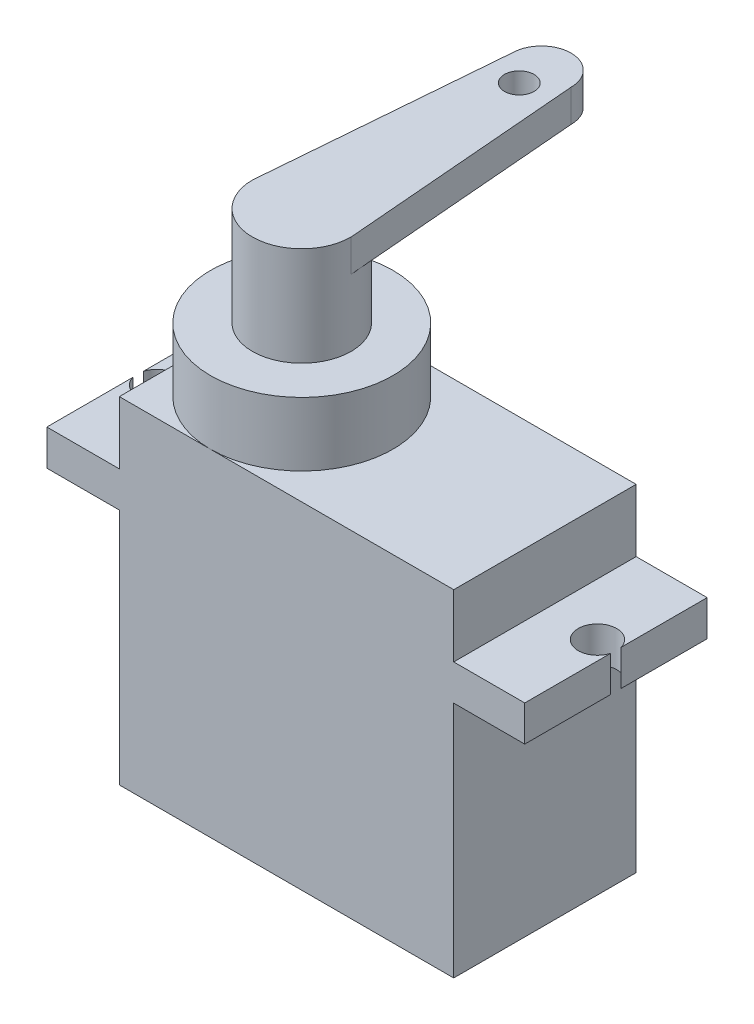
ISO-10303-21;
HEADER;
FILE_DESCRIPTION(('STEP AP214'),'2;1');
FILE_NAME('part.step','',(''),(''),'','','');
FILE_SCHEMA(('AUTOMOTIVE_DESIGN { 1 0 10303 214 1 1 1 1 }'));
ENDSEC;
DATA;
#1=APPLICATION_CONTEXT('core data for automotive mechanical design processes');
#2=APPLICATION_PROTOCOL_DEFINITION('international standard','automotive_design',2000,#1);
#3=PRODUCT_CONTEXT('',#1,'mechanical');
#4=PRODUCT('Part','Part','',(#3));
#5=PRODUCT_RELATED_PRODUCT_CATEGORY('part','',(#4));
#6=PRODUCT_DEFINITION_FORMATION('','',#4);
#7=PRODUCT_DEFINITION_CONTEXT('part definition',#1,'design');
#8=PRODUCT_DEFINITION('design','',#6,#7);
#9=PRODUCT_DEFINITION_SHAPE('','',#8);
#10=(LENGTH_UNIT() NAMED_UNIT(*) SI_UNIT(.MILLI.,.METRE.));
#11=(NAMED_UNIT(*) PLANE_ANGLE_UNIT() SI_UNIT($,.RADIAN.));
#12=(NAMED_UNIT(*) SI_UNIT($,.STERADIAN.) SOLID_ANGLE_UNIT());
#13=UNCERTAINTY_MEASURE_WITH_UNIT(LENGTH_MEASURE(1.E-05),#10,'distance_accuracy_value','');
#14=(GEOMETRIC_REPRESENTATION_CONTEXT(3) GLOBAL_UNCERTAINTY_ASSIGNED_CONTEXT((#13)) GLOBAL_UNIT_ASSIGNED_CONTEXT((#10,
#11,#12)) REPRESENTATION_CONTEXT('',''));
#15=CARTESIAN_POINT('',(0.,0.,0.));
#16=DIRECTION('',(0.,0.,1.));
#17=DIRECTION('',(1.,0.,0.));
#18=AXIS2_PLACEMENT_3D('',#15,#16,#17);
#19=CARTESIAN_POINT('',(27.4,18.5,-12.33));
#20=DIRECTION('',(-1.,0.,0.));
#21=DIRECTION('',(0.,0.,1.));
#22=AXIS2_PLACEMENT_3D('',#19,#20,#21);
#23=PLANE('',#22);
#24=DIRECTION('',(0.,0.,-1.));
#25=VECTOR('',#24,1.);
#26=CARTESIAN_POINT('',(27.4,16.09,-12.33));
#27=LINE('',#26,#25);
#28=CARTESIAN_POINT('',(27.4,16.09,0.));
#29=VERTEX_POINT('',#28);
#30=CARTESIAN_POINT('',(27.4,16.09,-5.80792857857286));
#31=VERTEX_POINT('',#30);
#32=EDGE_CURVE('E202',#29,#31,#27,.T.);
#33=ORIENTED_EDGE('',*,*,#32,.T.);
#34=DIRECTION('',(0.,1.,0.));
#35=VECTOR('',#34,1.);
#36=CARTESIAN_POINT('',(27.4,14.5,-5.80792857857286));
#37=LINE('',#36,#35);
#38=CARTESIAN_POINT('',(27.4,18.5,-5.80792857857286));
#39=VERTEX_POINT('',#38);
#40=EDGE_CURVE('E191',#31,#39,#37,.T.);
#41=ORIENTED_EDGE('',*,*,#40,.T.);
#42=DIRECTION('',(0.,0.,-1.));
#43=VECTOR('',#42,1.);
#44=CARTESIAN_POINT('',(27.4,18.5,-12.33));
#45=LINE('',#44,#43);
#46=CARTESIAN_POINT('',(27.4,18.5,0.));
#47=VERTEX_POINT('',#46);
#48=EDGE_CURVE('E200',#47,#39,#45,.T.);
#49=ORIENTED_EDGE('',*,*,#48,.F.);
#50=DIRECTION('',(0.,-1.,0.));
#51=VECTOR('',#50,1.);
#52=CARTESIAN_POINT('',(27.4,18.5,0.));
#53=LINE('',#52,#51);
#54=EDGE_CURVE('E251',#47,#29,#53,.T.);
#55=ORIENTED_EDGE('',*,*,#54,.T.);
#56=EDGE_LOOP('',(#33,#41,#49,#55));
#57=FACE_BOUND('',#56,.T.);
#58=ADVANCED_FACE('F40',(#57),#23,.F.);
#59=CARTESIAN_POINT('',(-4.9,18.5,-12.33));
#60=DIRECTION('',(1.,0.,0.));
#61=DIRECTION('',(0.,0.,-1.));
#62=AXIS2_PLACEMENT_3D('',#59,#60,#61);
#63=PLANE('',#62);
#64=DIRECTION('',(0.,0.,1.));
#65=VECTOR('',#64,1.);
#66=CARTESIAN_POINT('',(-4.9,16.09,-12.33));
#67=LINE('',#66,#65);
#68=CARTESIAN_POINT('',(-4.9,16.09,-12.33));
#69=VERTEX_POINT('',#68);
#70=CARTESIAN_POINT('',(-4.9,16.09,-6.52207142142714));
#71=VERTEX_POINT('',#70);
#72=EDGE_CURVE('E225',#69,#71,#67,.T.);
#73=ORIENTED_EDGE('',*,*,#72,.T.);
#74=DIRECTION('',(0.,1.,0.));
#75=VECTOR('',#74,1.);
#76=CARTESIAN_POINT('',(-4.9,14.5,-6.52207142142714));
#77=LINE('',#76,#75);
#78=CARTESIAN_POINT('',(-4.9,18.5,-6.52207142142714));
#79=VERTEX_POINT('',#78);
#80=EDGE_CURVE('E49',#71,#79,#77,.T.);
#81=ORIENTED_EDGE('',*,*,#80,.T.);
#82=DIRECTION('',(0.,0.,1.));
#83=VECTOR('',#82,1.);
#84=CARTESIAN_POINT('',(-4.9,18.5,-12.33));
#85=LINE('',#84,#83);
#86=CARTESIAN_POINT('',(-4.9,18.5,-12.33));
#87=VERTEX_POINT('',#86);
#88=EDGE_CURVE('E305',#87,#79,#85,.T.);
#89=ORIENTED_EDGE('',*,*,#88,.F.);
#90=DIRECTION('',(0.,-1.,0.));
#91=VECTOR('',#90,1.);
#92=CARTESIAN_POINT('',(-4.9,18.5,-12.33));
#93=LINE('',#92,#91);
#94=EDGE_CURVE('E224',#87,#69,#93,.T.);
#95=ORIENTED_EDGE('',*,*,#94,.T.);
#96=EDGE_LOOP('',(#73,#81,#89,#95));
#97=FACE_BOUND('',#96,.T.);
#98=ADVANCED_FACE('F304',(#97),#63,.F.);
#99=CARTESIAN_POINT('',(6.165,31.56,-6.165));
#100=DIRECTION('',(0.,1.,0.));
#101=DIRECTION('',(0.,0.,1.));
#102=AXIS2_PLACEMENT_3D('',#99,#100,#101);
#103=PLANE('',#102);
#104=DIRECTION('',(-0.0821290109856929,0.,0.99662170634324));
#105=VECTOR('',#104,1.);
#106=CARTESIAN_POINT('',(2.30629631931985,31.56,0.190055900388395));
#107=LINE('',#106,#105);
#108=CARTESIAN_POINT('',(2.8749903135514,31.56,-6.71094987230919));
#109=VERTEX_POINT('',#108);
#110=CARTESIAN_POINT('',(2.83,31.56,-6.16500000000001));
#111=VERTEX_POINT('',#110);
#112=EDGE_CURVE('E298',#109,#111,#107,.T.);
#113=ORIENTED_EDGE('',*,*,#112,.F.);
#114=CARTESIAN_POINT('',(6.165,31.56,-6.165));
#115=DIRECTION('',(0.,1.,0.));
#116=DIRECTION('',(0.,0.,1.));
#117=AXIS2_PLACEMENT_3D('',#114,#115,#116);
#118=CIRCLE('',#117,3.335);
#119=EDGE_CURVE('E375',#109,#111,#118,.T.);
#120=ORIENTED_EDGE('',*,*,#119,.T.);
#121=EDGE_LOOP('',(#113,#120));
#122=FACE_BOUND('',#121,.T.);
#123=ADVANCED_FACE('F502',(#122),#103,.T.);
#124=CARTESIAN_POINT('',(0.,22.73,0.));
#125=DIRECTION('',(0.,-1.,0.));
#126=DIRECTION('',(0.,0.,-1.));
#127=AXIS2_PLACEMENT_3D('',#124,#125,#126);
#128=PLANE('',#127);
#129=CARTESIAN_POINT('',(6.165,22.73,-6.165));
#130=DIRECTION('',(0.,1.,0.));
#131=DIRECTION('',(0.,0.,-1.));
#132=AXIS2_PLACEMENT_3D('',#129,#130,#131);
#133=CIRCLE('',#132,6.165);
#134=CARTESIAN_POINT('',(6.165,22.73,-12.33));
#135=VERTEX_POINT('',#134);
#136=CARTESIAN_POINT('',(0.,22.73,-6.165));
#137=VERTEX_POINT('',#136);
#138=EDGE_CURVE('E359',#135,#137,#133,.T.);
#139=ORIENTED_EDGE('',*,*,#138,.F.);
#140=DIRECTION('',(-1.,0.,0.));
#141=VECTOR('',#140,1.);
#142=CARTESIAN_POINT('',(0.,22.73,-12.33));
#143=LINE('',#142,#141);
#144=CARTESIAN_POINT('',(0.,22.73,-12.33));
#145=VERTEX_POINT('',#144);
#146=EDGE_CURVE('E346',#135,#145,#143,.T.);
#147=ORIENTED_EDGE('',*,*,#146,.T.);
#148=DIRECTION('',(0.,0.,1.));
#149=VECTOR('',#148,1.);
#150=CARTESIAN_POINT('',(0.,22.73,0.));
#151=LINE('',#150,#149);
#152=EDGE_CURVE('E355',#145,#137,#151,.T.);
#153=ORIENTED_EDGE('',*,*,#152,.T.);
#154=EDGE_LOOP('',(#139,#147,#153));
#155=FACE_BOUND('',#154,.T.);
#156=ADVANCED_FACE('F551',(#155),#128,.F.);
#157=CARTESIAN_POINT('',(6.165,22.73,0.));
#158=VERTEX_POINT('',#157);
#159=EDGE_CURVE('E364',#137,#158,#133,.T.);
#160=ORIENTED_EDGE('',*,*,#159,.F.);
#161=CARTESIAN_POINT('',(0.,22.73,0.));
#162=VERTEX_POINT('',#161);
#163=EDGE_CURVE('E338',#137,#162,#151,.T.);
#164=ORIENTED_EDGE('',*,*,#163,.T.);
#165=DIRECTION('',(1.,0.,0.));
#166=VECTOR('',#165,1.);
#167=CARTESIAN_POINT('',(0.,22.73,0.));
#168=LINE('',#167,#166);
#169=EDGE_CURVE('E350',#162,#158,#168,.T.);
#170=ORIENTED_EDGE('',*,*,#169,.T.);
#171=EDGE_LOOP('',(#160,#164,#170));
#172=FACE_BOUND('',#171,.T.);
#173=ADVANCED_FACE('F560',(#172),#128,.F.);
#174=CARTESIAN_POINT('',(0.,18.5,0.));
#175=DIRECTION('',(0.,1.,0.));
#176=DIRECTION('',(0.,0.,1.));
#177=AXIS2_PLACEMENT_3D('',#174,#175,#176);
#178=PLANE('',#177);
#179=CARTESIAN_POINT('',(-3.65,18.5,-6.165));
#180=DIRECTION('',(0.,1.,0.));
#181=DIRECTION('',(0.,0.,1.));
#182=AXIS2_PLACEMENT_3D('',#179,#180,#181);
#183=CIRCLE('',#182,1.3);
#184=CARTESIAN_POINT('',(-4.9,18.5,-5.80792857857286));
#185=VERTEX_POINT('',#184);
#186=EDGE_CURVE('E204',#185,#79,#183,.T.);
#187=ORIENTED_EDGE('',*,*,#186,.F.);
#188=CARTESIAN_POINT('',(-4.9,18.5,0.));
#189=VERTEX_POINT('',#188);
#190=EDGE_CURVE('E243',#185,#189,#85,.T.);
#191=ORIENTED_EDGE('',*,*,#190,.T.);
#192=DIRECTION('',(1.,0.,0.));
#193=VECTOR('',#192,1.);
#194=CARTESIAN_POINT('',(-4.9,18.5,0.));
#195=LINE('',#194,#193);
#196=CARTESIAN_POINT('',(0.,18.5,0.));
#197=VERTEX_POINT('',#196);
#198=EDGE_CURVE('E219',#189,#197,#195,.T.);
#199=ORIENTED_EDGE('',*,*,#198,.T.);
#200=DIRECTION('',(0.,0.,1.));
#201=VECTOR('',#200,1.);
#202=CARTESIAN_POINT('',(0.,18.5,0.));
#203=LINE('',#202,#201);
#204=CARTESIAN_POINT('',(0.,18.5,-12.33));
#205=VERTEX_POINT('',#204);
#206=EDGE_CURVE('E339',#205,#197,#203,.T.);
#207=ORIENTED_EDGE('',*,*,#206,.F.);
#208=DIRECTION('',(-1.,0.,0.));
#209=VECTOR('',#208,1.);
#210=CARTESIAN_POINT('',(-4.9,18.5,-12.33));
#211=LINE('',#210,#209);
#212=EDGE_CURVE('E212',#205,#87,#211,.T.);
#213=ORIENTED_EDGE('',*,*,#212,.T.);
#214=ORIENTED_EDGE('',*,*,#88,.T.);
#215=EDGE_LOOP('',(#187,#191,#199,#207,#213,#214));
#216=FACE_BOUND('',#215,.T.);
#217=ADVANCED_FACE('F309',(#216),#178,.T.);
#218=CARTESIAN_POINT('',(0.,16.09,0.));
#219=DIRECTION('',(1.,0.,0.));
#220=DIRECTION('',(0.,0.,-1.));
#221=AXIS2_PLACEMENT_3D('',#218,#219,#220);
#222=PLANE('',#221);
#223=DIRECTION('',(0.,0.,1.));
#224=VECTOR('',#223,1.);
#225=CARTESIAN_POINT('',(0.,0.,0.));
#226=LINE('',#225,#224);
#227=CARTESIAN_POINT('',(0.,0.,-12.33));
#228=VERTEX_POINT('',#227);
#229=CARTESIAN_POINT('',(0.,0.,0.));
#230=VERTEX_POINT('',#229);
#231=EDGE_CURVE('E258',#228,#230,#226,.T.);
#232=ORIENTED_EDGE('',*,*,#231,.T.);
#233=DIRECTION('',(0.,-1.,0.));
#234=VECTOR('',#233,1.);
#235=CARTESIAN_POINT('',(0.,16.09,0.));
#236=LINE('',#235,#234);
#237=CARTESIAN_POINT('',(0.,16.09,0.));
#238=VERTEX_POINT('',#237);
#239=EDGE_CURVE('E291',#238,#230,#236,.T.);
#240=ORIENTED_EDGE('',*,*,#239,.F.);
#241=DIRECTION('',(0.,0.,1.));
#242=VECTOR('',#241,1.);
#243=CARTESIAN_POINT('',(0.,16.09,0.));
#244=LINE('',#243,#242);
#245=CARTESIAN_POINT('',(0.,16.09,-12.33));
#246=VERTEX_POINT('',#245);
#247=EDGE_CURVE('E259',#246,#238,#244,.T.);
#248=ORIENTED_EDGE('',*,*,#247,.F.);
#249=DIRECTION('',(0.,-1.,0.));
#250=VECTOR('',#249,1.);
#251=CARTESIAN_POINT('',(0.,16.09,-12.33));
#252=LINE('',#251,#250);
#253=EDGE_CURVE('E268',#246,#228,#252,.T.);
#254=ORIENTED_EDGE('',*,*,#253,.T.);
#255=EDGE_LOOP('',(#232,#240,#248,#254));
#256=FACE_BOUND('',#255,.T.);
#257=ADVANCED_FACE('F42',(#256),#222,.F.);
#258=CARTESIAN_POINT('',(0.,16.09,0.));
#259=DIRECTION('',(0.,0.,-1.));
#260=DIRECTION('',(-1.,0.,0.));
#261=AXIS2_PLACEMENT_3D('',#258,#259,#260);
#262=PLANE('',#261);
#263=DIRECTION('',(1.,0.,0.));
#264=VECTOR('',#263,1.);
#265=CARTESIAN_POINT('',(0.,0.,0.));
#266=LINE('',#265,#264);
#267=CARTESIAN_POINT('',(22.6,0.,0.));
#268=VERTEX_POINT('',#267);
#269=EDGE_CURVE('E272',#230,#268,#266,.T.);
#270=ORIENTED_EDGE('',*,*,#269,.T.);
#271=DIRECTION('',(0.,-1.,0.));
#272=VECTOR('',#271,1.);
#273=CARTESIAN_POINT('',(22.6,16.09,0.));
#274=LINE('',#273,#272);
#275=CARTESIAN_POINT('',(22.6,16.09,0.));
#276=VERTEX_POINT('',#275);
#277=EDGE_CURVE('E287',#276,#268,#274,.T.);
#278=ORIENTED_EDGE('',*,*,#277,.F.);
#279=DIRECTION('',(1.,0.,0.));
#280=VECTOR('',#279,1.);
#281=CARTESIAN_POINT('',(-4.9,16.09,0.));
#282=LINE('',#281,#280);
#283=EDGE_CURVE('E229',#276,#29,#282,.T.);
#284=ORIENTED_EDGE('',*,*,#283,.T.);
#285=ORIENTED_EDGE('',*,*,#54,.F.);
#286=CARTESIAN_POINT('',(22.6,18.5,0.));
#287=VERTEX_POINT('',#286);
#288=EDGE_CURVE('E209',#287,#47,#195,.T.);
#289=ORIENTED_EDGE('',*,*,#288,.F.);
#290=DIRECTION('',(0.,-1.,0.));
#291=VECTOR('',#290,1.);
#292=CARTESIAN_POINT('',(22.6,22.73,0.));
#293=LINE('',#292,#291);
#294=CARTESIAN_POINT('',(22.6,22.73,0.));
#295=VERTEX_POINT('',#294);
#296=EDGE_CURVE('E321',#295,#287,#293,.T.);
#297=ORIENTED_EDGE('',*,*,#296,.F.);
#298=EDGE_CURVE('E354',#158,#295,#168,.T.);
#299=ORIENTED_EDGE('',*,*,#298,.F.);
#300=ORIENTED_EDGE('',*,*,#169,.F.);
#301=DIRECTION('',(0.,-1.,0.));
#302=VECTOR('',#301,1.);
#303=CARTESIAN_POINT('',(0.,22.73,0.));
#304=LINE('',#303,#302);
#305=EDGE_CURVE('E317',#162,#197,#304,.T.);
#306=ORIENTED_EDGE('',*,*,#305,.T.);
#307=ORIENTED_EDGE('',*,*,#198,.F.);
#308=DIRECTION('',(0.,-1.,0.));
#309=VECTOR('',#308,1.);
#310=CARTESIAN_POINT('',(-4.9,18.5,0.));
#311=LINE('',#310,#309);
#312=CARTESIAN_POINT('',(-4.9,16.09,0.));
#313=VERTEX_POINT('',#312);
#314=EDGE_CURVE('E254',#189,#313,#311,.T.);
#315=ORIENTED_EDGE('',*,*,#314,.T.);
#316=EDGE_CURVE('E231',#313,#238,#282,.T.);
#317=ORIENTED_EDGE('',*,*,#316,.T.);
#318=ORIENTED_EDGE('',*,*,#239,.T.);
#319=EDGE_LOOP('',(#270,#278,#284,#285,#289,#297,#299,#300,#306,#307,#315,#317,#318));
#320=FACE_BOUND('',#319,.T.);
#321=ADVANCED_FACE('F532',(#320),#262,.F.);
#322=CARTESIAN_POINT('',(22.6,16.09,0.));
#323=DIRECTION('',(-1.,0.,0.));
#324=DIRECTION('',(0.,0.,1.));
#325=AXIS2_PLACEMENT_3D('',#322,#323,#324);
#326=PLANE('',#325);
#327=DIRECTION('',(0.,0.,-1.));
#328=VECTOR('',#327,1.);
#329=CARTESIAN_POINT('',(22.6,0.,0.));
#330=LINE('',#329,#328);
#331=CARTESIAN_POINT('',(22.6,0.,-12.33));
#332=VERTEX_POINT('',#331);
#333=EDGE_CURVE('E275',#268,#332,#330,.T.);
#334=ORIENTED_EDGE('',*,*,#333,.T.);
#335=DIRECTION('',(0.,-1.,0.));
#336=VECTOR('',#335,1.);
#337=CARTESIAN_POINT('',(22.6,16.09,-12.33));
#338=LINE('',#337,#336);
#339=CARTESIAN_POINT('',(22.6,16.09,-12.33));
#340=VERTEX_POINT('',#339);
#341=EDGE_CURVE('E283',#340,#332,#338,.T.);
#342=ORIENTED_EDGE('',*,*,#341,.F.);
#343=DIRECTION('',(0.,0.,-1.));
#344=VECTOR('',#343,1.);
#345=CARTESIAN_POINT('',(22.6,16.09,0.));
#346=LINE('',#345,#344);
#347=EDGE_CURVE('E263',#276,#340,#346,.T.);
#348=ORIENTED_EDGE('',*,*,#347,.F.);
#349=ORIENTED_EDGE('',*,*,#277,.T.);
#350=EDGE_LOOP('',(#334,#342,#348,#349));
#351=FACE_BOUND('',#350,.T.);
#352=ADVANCED_FACE('F588',(#351),#326,.F.);
#353=CARTESIAN_POINT('',(0.,16.09,-12.33));
#354=DIRECTION('',(0.,0.,1.));
#355=DIRECTION('',(1.,0.,0.));
#356=AXIS2_PLACEMENT_3D('',#353,#354,#355);
#357=PLANE('',#356);
#358=DIRECTION('',(-1.,0.,0.));
#359=VECTOR('',#358,1.);
#360=CARTESIAN_POINT('',(0.,0.,-12.33));
#361=LINE('',#360,#359);
#362=EDGE_CURVE('E264',#332,#228,#361,.T.);
#363=ORIENTED_EDGE('',*,*,#362,.T.);
#364=ORIENTED_EDGE('',*,*,#253,.F.);
#365=DIRECTION('',(-1.,0.,0.));
#366=VECTOR('',#365,1.);
#367=CARTESIAN_POINT('',(-4.9,16.09,-12.33));
#368=LINE('',#367,#366);
#369=EDGE_CURVE('E238',#246,#69,#368,.T.);
#370=ORIENTED_EDGE('',*,*,#369,.T.);
#371=ORIENTED_EDGE('',*,*,#94,.F.);
#372=ORIENTED_EDGE('',*,*,#212,.F.);
#373=DIRECTION('',(0.,-1.,0.));
#374=VECTOR('',#373,1.);
#375=CARTESIAN_POINT('',(0.,22.73,-12.33));
#376=LINE('',#375,#374);
#377=EDGE_CURVE('E329',#145,#205,#376,.T.);
#378=ORIENTED_EDGE('',*,*,#377,.F.);
#379=ORIENTED_EDGE('',*,*,#146,.F.);
#380=CARTESIAN_POINT('',(22.6,22.73,-12.33));
#381=VERTEX_POINT('',#380);
#382=EDGE_CURVE('E333',#381,#135,#143,.T.);
#383=ORIENTED_EDGE('',*,*,#382,.F.);
#384=DIRECTION('',(0.,-1.,0.));
#385=VECTOR('',#384,1.);
#386=CARTESIAN_POINT('',(22.6,22.73,-12.33));
#387=LINE('',#386,#385);
#388=CARTESIAN_POINT('',(22.6,18.5,-12.33));
#389=VERTEX_POINT('',#388);
#390=EDGE_CURVE('E325',#381,#389,#387,.T.);
#391=ORIENTED_EDGE('',*,*,#390,.T.);
#392=CARTESIAN_POINT('',(27.4,18.5,-12.33));
#393=VERTEX_POINT('',#392);
#394=EDGE_CURVE('E217',#393,#389,#211,.T.);
#395=ORIENTED_EDGE('',*,*,#394,.F.);
#396=DIRECTION('',(0.,-1.,0.));
#397=VECTOR('',#396,1.);
#398=CARTESIAN_POINT('',(27.4,18.5,-12.33));
#399=LINE('',#398,#397);
#400=CARTESIAN_POINT('',(27.4,16.09,-12.33));
#401=VERTEX_POINT('',#400);
#402=EDGE_CURVE('E247',#393,#401,#399,.T.);
#403=ORIENTED_EDGE('',*,*,#402,.T.);
#404=EDGE_CURVE('E239',#401,#340,#368,.T.);
#405=ORIENTED_EDGE('',*,*,#404,.T.);
#406=ORIENTED_EDGE('',*,*,#341,.T.);
#407=EDGE_LOOP('',(#363,#364,#370,#371,#372,#378,#379,#383,#391,#395,#403,#405,#406));
#408=FACE_BOUND('',#407,.T.);
#409=ADVANCED_FACE('F481',(#408),#357,.F.);
#410=CARTESIAN_POINT('',(0.,0.,0.));
#411=DIRECTION('',(0.,-1.,0.));
#412=DIRECTION('',(0.,0.,-1.));
#413=AXIS2_PLACEMENT_3D('',#410,#411,#412);
#414=PLANE('',#413);
#415=ORIENTED_EDGE('',*,*,#231,.F.);
#416=ORIENTED_EDGE('',*,*,#362,.F.);
#417=ORIENTED_EDGE('',*,*,#333,.F.);
#418=ORIENTED_EDGE('',*,*,#269,.F.);
#419=EDGE_LOOP('',(#415,#416,#417,#418));
#420=FACE_BOUND('',#419,.T.);
#421=ADVANCED_FACE('F542',(#420),#414,.T.);
#422=CARTESIAN_POINT('',(0.,16.09,0.));
#423=DIRECTION('',(0.,1.,0.));
#424=DIRECTION('',(0.,0.,1.));
#425=AXIS2_PLACEMENT_3D('',#422,#423,#424);
#426=PLANE('',#425);
#427=CARTESIAN_POINT('',(-4.9,16.09,-5.80792857857286));
#428=VERTEX_POINT('',#427);
#429=EDGE_CURVE('E230',#428,#313,#67,.T.);
#430=ORIENTED_EDGE('',*,*,#429,.F.);
#431=CARTESIAN_POINT('',(-3.65,16.09,-6.165));
#432=DIRECTION('',(0.,1.,0.));
#433=DIRECTION('',(0.,0.,1.));
#434=AXIS2_PLACEMENT_3D('',#431,#432,#433);
#435=CIRCLE('',#434,1.3);
#436=EDGE_CURVE('E63',#428,#71,#435,.T.);
#437=ORIENTED_EDGE('',*,*,#436,.T.);
#438=ORIENTED_EDGE('',*,*,#72,.F.);
#439=ORIENTED_EDGE('',*,*,#369,.F.);
#440=ORIENTED_EDGE('',*,*,#247,.T.);
#441=ORIENTED_EDGE('',*,*,#316,.F.);
#442=EDGE_LOOP('',(#430,#437,#438,#439,#440,#441));
#443=FACE_BOUND('',#442,.T.);
#444=ADVANCED_FACE('F485',(#443),#426,.F.);
#445=CARTESIAN_POINT('',(27.4,16.09,-6.52207142142714));
#446=VERTEX_POINT('',#445);
#447=EDGE_CURVE('E235',#446,#401,#27,.T.);
#448=ORIENTED_EDGE('',*,*,#447,.F.);
#449=CARTESIAN_POINT('',(26.15,16.09,-6.165));
#450=DIRECTION('',(0.,1.,0.));
#451=DIRECTION('',(0.,0.,1.));
#452=AXIS2_PLACEMENT_3D('',#449,#450,#451);
#453=CIRCLE('',#452,1.3);
#454=EDGE_CURVE('E205',#446,#31,#453,.T.);
#455=ORIENTED_EDGE('',*,*,#454,.T.);
#456=ORIENTED_EDGE('',*,*,#32,.F.);
#457=ORIENTED_EDGE('',*,*,#283,.F.);
#458=ORIENTED_EDGE('',*,*,#347,.T.);
#459=ORIENTED_EDGE('',*,*,#404,.F.);
#460=EDGE_LOOP('',(#448,#455,#456,#457,#458,#459));
#461=FACE_BOUND('',#460,.T.);
#462=ADVANCED_FACE('F513',(#461),#426,.F.);
#463=ORIENTED_EDGE('',*,*,#190,.F.);
#464=DIRECTION('',(0.,1.,0.));
#465=VECTOR('',#464,1.);
#466=CARTESIAN_POINT('',(-4.9,14.5,-5.80792857857286));
#467=LINE('',#466,#465);
#468=EDGE_CURVE('E296',#185,#428,#467,.F.);
#469=ORIENTED_EDGE('',*,*,#468,.T.);
#470=ORIENTED_EDGE('',*,*,#429,.T.);
#471=ORIENTED_EDGE('',*,*,#314,.F.);
#472=EDGE_LOOP('',(#463,#469,#470,#471));
#473=FACE_BOUND('',#472,.T.);
#474=ADVANCED_FACE('F489',(#473),#63,.F.);
#475=CARTESIAN_POINT('',(27.4,18.5,-6.52207142142714));
#476=VERTEX_POINT('',#475);
#477=EDGE_CURVE('E213',#476,#393,#45,.T.);
#478=ORIENTED_EDGE('',*,*,#477,.F.);
#479=DIRECTION('',(0.,1.,0.));
#480=VECTOR('',#479,1.);
#481=CARTESIAN_POINT('',(27.4,14.5,-6.52207142142714));
#482=LINE('',#481,#480);
#483=EDGE_CURVE('E55',#476,#446,#482,.F.);
#484=ORIENTED_EDGE('',*,*,#483,.T.);
#485=ORIENTED_EDGE('',*,*,#447,.T.);
#486=ORIENTED_EDGE('',*,*,#402,.F.);
#487=EDGE_LOOP('',(#478,#484,#485,#486));
#488=FACE_BOUND('',#487,.T.);
#489=ADVANCED_FACE('F498',(#488),#23,.F.);
#490=CARTESIAN_POINT('',(26.15,18.5,-6.165));
#491=DIRECTION('',(0.,1.,0.));
#492=DIRECTION('',(0.,0.,1.));
#493=AXIS2_PLACEMENT_3D('',#490,#491,#492);
#494=CIRCLE('',#493,1.3);
#495=EDGE_CURVE('E11',#476,#39,#494,.T.);
#496=ORIENTED_EDGE('',*,*,#495,.F.);
#497=ORIENTED_EDGE('',*,*,#477,.T.);
#498=ORIENTED_EDGE('',*,*,#394,.T.);
#499=DIRECTION('',(0.,0.,-1.));
#500=VECTOR('',#499,1.);
#501=CARTESIAN_POINT('',(22.6,18.5,0.));
#502=LINE('',#501,#500);
#503=EDGE_CURVE('E334',#287,#389,#502,.T.);
#504=ORIENTED_EDGE('',*,*,#503,.F.);
#505=ORIENTED_EDGE('',*,*,#288,.T.);
#506=ORIENTED_EDGE('',*,*,#48,.T.);
#507=EDGE_LOOP('',(#496,#497,#498,#504,#505,#506));
#508=FACE_BOUND('',#507,.T.);
#509=ADVANCED_FACE('F207',(#508),#178,.T.);
#510=CARTESIAN_POINT('',(0.,22.73,0.));
#511=DIRECTION('',(1.,0.,0.));
#512=DIRECTION('',(0.,0.,-1.));
#513=AXIS2_PLACEMENT_3D('',#510,#511,#512);
#514=PLANE('',#513);
#515=ORIENTED_EDGE('',*,*,#206,.T.);
#516=ORIENTED_EDGE('',*,*,#305,.F.);
#517=ORIENTED_EDGE('',*,*,#163,.F.);
#518=ORIENTED_EDGE('',*,*,#152,.F.);
#519=ORIENTED_EDGE('',*,*,#377,.T.);
#520=EDGE_LOOP('',(#515,#516,#517,#518,#519));
#521=FACE_BOUND('',#520,.T.);
#522=ADVANCED_FACE('F511',(#521),#514,.F.);
#523=CARTESIAN_POINT('',(22.6,22.73,0.));
#524=DIRECTION('',(-1.,0.,0.));
#525=DIRECTION('',(0.,0.,1.));
#526=AXIS2_PLACEMENT_3D('',#523,#524,#525);
#527=PLANE('',#526);
#528=ORIENTED_EDGE('',*,*,#503,.T.);
#529=ORIENTED_EDGE('',*,*,#390,.F.);
#530=DIRECTION('',(0.,0.,-1.));
#531=VECTOR('',#530,1.);
#532=CARTESIAN_POINT('',(22.6,22.73,0.));
#533=LINE('',#532,#531);
#534=EDGE_CURVE('E347',#295,#381,#533,.T.);
#535=ORIENTED_EDGE('',*,*,#534,.F.);
#536=ORIENTED_EDGE('',*,*,#296,.T.);
#537=EDGE_LOOP('',(#528,#529,#535,#536));
#538=FACE_BOUND('',#537,.T.);
#539=ADVANCED_FACE('F519',(#538),#527,.F.);
#540=EDGE_CURVE('E295',#158,#135,#133,.T.);
#541=ORIENTED_EDGE('',*,*,#540,.F.);
#542=ORIENTED_EDGE('',*,*,#298,.T.);
#543=ORIENTED_EDGE('',*,*,#534,.T.);
#544=ORIENTED_EDGE('',*,*,#382,.T.);
#545=EDGE_LOOP('',(#541,#542,#543,#544));
#546=FACE_BOUND('',#545,.T.);
#547=ADVANCED_FACE('F527',(#546),#128,.F.);
#548=CARTESIAN_POINT('',(6.165,27.04,-6.165));
#549=DIRECTION('',(0.,-1.,0.));
#550=DIRECTION('',(0.,0.,-1.));
#551=AXIS2_PLACEMENT_3D('',#548,#549,#550);
#552=CYLINDRICAL_SURFACE('',#551,6.165);
#553=ORIENTED_EDGE('',*,*,#138,.T.);
#554=ORIENTED_EDGE('',*,*,#159,.T.);
#555=ORIENTED_EDGE('',*,*,#540,.T.);
#556=EDGE_LOOP('',(#553,#554,#555));
#557=FACE_BOUND('',#556,.T.);
#558=CARTESIAN_POINT('',(6.165,27.04,-6.165));
#559=DIRECTION('',(0.,1.,0.));
#560=DIRECTION('',(0.,0.,1.));
#561=AXIS2_PLACEMENT_3D('',#558,#559,#560);
#562=CIRCLE('',#561,6.165);
#563=CARTESIAN_POINT('',(6.165,27.04,0.));
#564=VERTEX_POINT('',#563);
#565=EDGE_CURVE('E343',#564,#564,#562,.T.);
#566=ORIENTED_EDGE('',*,*,#565,.F.);
#567=EDGE_LOOP('',(#566));
#568=FACE_BOUND('',#567,.T.);
#569=ADVANCED_FACE('F554',(#557,#568),#552,.T.);
#570=CARTESIAN_POINT('',(6.165,27.04,-6.165));
#571=DIRECTION('',(0.,1.,0.));
#572=DIRECTION('',(0.,0.,1.));
#573=AXIS2_PLACEMENT_3D('',#570,#571,#572);
#574=PLANE('',#573);
#575=CARTESIAN_POINT('',(6.165,27.04,-6.165));
#576=DIRECTION('',(0.,1.,0.));
#577=DIRECTION('',(0.,0.,1.));
#578=AXIS2_PLACEMENT_3D('',#575,#576,#577);
#579=CIRCLE('',#578,3.335);
#580=CARTESIAN_POINT('',(6.165,27.04,-2.83));
#581=VERTEX_POINT('',#580);
#582=EDGE_CURVE('E368',#581,#581,#579,.T.);
#583=ORIENTED_EDGE('',*,*,#582,.F.);
#584=EDGE_LOOP('',(#583));
#585=FACE_BOUND('',#584,.T.);
#586=ORIENTED_EDGE('',*,*,#565,.T.);
#587=EDGE_LOOP('',(#586));
#588=FACE_BOUND('',#587,.T.);
#589=ADVANCED_FACE('F574',(#585,#588),#574,.T.);
#590=CARTESIAN_POINT('',(6.165,31.56,-6.165));
#591=DIRECTION('',(0.,-1.,0.));
#592=DIRECTION('',(0.,0.,-1.));
#593=AXIS2_PLACEMENT_3D('',#590,#591,#592);
#594=CYLINDRICAL_SURFACE('',#593,3.335);
#595=CARTESIAN_POINT('',(9.5,31.56,-6.16500000000001));
#596=VERTEX_POINT('',#595);
#597=CARTESIAN_POINT('',(9.4550096864486,31.56,-6.71094987230918));
#598=VERTEX_POINT('',#597);
#599=EDGE_CURVE('E363',#596,#598,#118,.T.);
#600=ORIENTED_EDGE('',*,*,#599,.F.);
#601=DIRECTION('',(0.,-1.,0.));
#602=VECTOR('',#601,1.);
#603=CARTESIAN_POINT('',(9.5,33.74,-6.16500000000001));
#604=LINE('',#603,#602);
#605=CARTESIAN_POINT('',(9.5,33.74,-6.16500000000001));
#606=VERTEX_POINT('',#605);
#607=EDGE_CURVE('E376',#606,#596,#604,.T.);
#608=ORIENTED_EDGE('',*,*,#607,.F.);
#609=CARTESIAN_POINT('',(6.165,33.74,-6.165));
#610=DIRECTION('',(0.,1.,0.));
#611=DIRECTION('',(0.,0.,1.));
#612=AXIS2_PLACEMENT_3D('',#609,#610,#611);
#613=CIRCLE('',#612,3.335);
#614=CARTESIAN_POINT('',(2.83,33.74,-6.16500000000001));
#615=VERTEX_POINT('',#614);
#616=EDGE_CURVE('E397',#615,#606,#613,.T.);
#617=ORIENTED_EDGE('',*,*,#616,.F.);
#618=DIRECTION('',(0.,-1.,0.));
#619=VECTOR('',#618,1.);
#620=CARTESIAN_POINT('',(2.83,33.74,-6.16500000000001));
#621=LINE('',#620,#619);
#622=EDGE_CURVE('E388',#615,#111,#621,.T.);
#623=ORIENTED_EDGE('',*,*,#622,.T.);
#624=ORIENTED_EDGE('',*,*,#119,.F.);
#625=EDGE_CURVE('E374',#598,#109,#118,.T.);
#626=ORIENTED_EDGE('',*,*,#625,.F.);
#627=EDGE_LOOP('',(#600,#608,#617,#623,#624,#626));
#628=FACE_BOUND('',#627,.T.);
#629=ORIENTED_EDGE('',*,*,#582,.T.);
#630=EDGE_LOOP('',(#629));
#631=FACE_BOUND('',#630,.T.);
#632=ADVANCED_FACE('F450',(#628,#631),#594,.T.);
#633=DIRECTION('',(-0.0821290109856929,0.,-0.99662170634324));
#634=VECTOR('',#633,1.);
#635=CARTESIAN_POINT('',(9.94053567976729,31.56,-0.819173773610452));
#636=LINE('',#635,#634);
#637=EDGE_CURVE('E401',#596,#598,#636,.T.);
#638=ORIENTED_EDGE('',*,*,#637,.F.);
#639=ORIENTED_EDGE('',*,*,#599,.T.);
#640=EDGE_LOOP('',(#638,#639));
#641=FACE_BOUND('',#640,.T.);
#642=ADVANCED_FACE('F660',(#641),#103,.T.);
#643=CARTESIAN_POINT('',(0.,31.56,0.));
#644=DIRECTION('',(0.,1.,0.));
#645=DIRECTION('',(0.,0.,1.));
#646=AXIS2_PLACEMENT_3D('',#643,#644,#645);
#647=PLANE('',#646);
#648=CARTESIAN_POINT('',(6.165,31.56,-20.865));
#649=DIRECTION('',(0.,1.,0.));
#650=DIRECTION('',(0.,0.,1.));
#651=AXIS2_PLACEMENT_3D('',#648,#649,#650);
#652=CIRCLE('',#651,1.);
#653=CARTESIAN_POINT('',(6.165,31.56,-19.865));
#654=VERTEX_POINT('',#653);
#655=EDGE_CURVE('E425',#654,#654,#652,.T.);
#656=ORIENTED_EDGE('',*,*,#655,.T.);
#657=EDGE_LOOP('',(#656));
#658=FACE_BOUND('',#657,.T.);
#659=CARTESIAN_POINT('',(8.165,31.56,-22.365));
#660=VERTEX_POINT('',#659);
#661=EDGE_CURVE('E405',#598,#660,#636,.T.);
#662=ORIENTED_EDGE('',*,*,#661,.F.);
#663=ORIENTED_EDGE('',*,*,#625,.T.);
#664=CARTESIAN_POINT('',(4.165,31.56,-22.365));
#665=VERTEX_POINT('',#664);
#666=EDGE_CURVE('E393',#665,#109,#107,.T.);
#667=ORIENTED_EDGE('',*,*,#666,.F.);
#668=CARTESIAN_POINT('',(6.165,31.56,-22.365));
#669=DIRECTION('',(0.,1.,0.));
#670=DIRECTION('',(0.,0.,1.));
#671=AXIS2_PLACEMENT_3D('',#668,#669,#670);
#672=CIRCLE('',#671,2.);
#673=EDGE_CURVE('E398',#660,#665,#672,.T.);
#674=ORIENTED_EDGE('',*,*,#673,.F.);
#675=EDGE_LOOP('',(#662,#663,#667,#674));
#676=FACE_BOUND('',#675,.T.);
#677=ADVANCED_FACE('F469',(#658,#676),#647,.F.);
#678=CARTESIAN_POINT('',(9.94053567976729,33.74,-0.819173773610452));
#679=DIRECTION('',(-0.99662170634324,0.,0.0821290109856929));
#680=DIRECTION('',(0.0821290109856929,0.,0.99662170634324));
#681=AXIS2_PLACEMENT_3D('',#678,#679,#680);
#682=PLANE('',#681);
#683=ORIENTED_EDGE('',*,*,#637,.T.);
#684=ORIENTED_EDGE('',*,*,#661,.T.);
#685=DIRECTION('',(0.,-1.,0.));
#686=VECTOR('',#685,1.);
#687=CARTESIAN_POINT('',(8.165,33.74,-22.365));
#688=LINE('',#687,#686);
#689=CARTESIAN_POINT('',(8.165,33.74,-22.365));
#690=VERTEX_POINT('',#689);
#691=EDGE_CURVE('E380',#690,#660,#688,.T.);
#692=ORIENTED_EDGE('',*,*,#691,.F.);
#693=DIRECTION('',(-0.0821290109856929,0.,-0.99662170634324));
#694=VECTOR('',#693,1.);
#695=CARTESIAN_POINT('',(9.94053567976729,33.74,-0.819173773610452));
#696=LINE('',#695,#694);
#697=EDGE_CURVE('E411',#606,#690,#696,.T.);
#698=ORIENTED_EDGE('',*,*,#697,.F.);
#699=ORIENTED_EDGE('',*,*,#607,.T.);
#700=EDGE_LOOP('',(#683,#684,#692,#698,#699));
#701=FACE_BOUND('',#700,.T.);
#702=ADVANCED_FACE('F454',(#701),#682,.F.);
#703=CARTESIAN_POINT('',(6.165,33.74,-22.365));
#704=DIRECTION('',(0.,-1.,0.));
#705=DIRECTION('',(0.,0.,-1.));
#706=AXIS2_PLACEMENT_3D('',#703,#704,#705);
#707=CYLINDRICAL_SURFACE('',#706,2.);
#708=ORIENTED_EDGE('',*,*,#673,.T.);
#709=DIRECTION('',(0.,-1.,0.));
#710=VECTOR('',#709,1.);
#711=CARTESIAN_POINT('',(4.165,33.74,-22.365));
#712=LINE('',#711,#710);
#713=CARTESIAN_POINT('',(4.165,33.74,-22.365));
#714=VERTEX_POINT('',#713);
#715=EDGE_CURVE('E384',#714,#665,#712,.T.);
#716=ORIENTED_EDGE('',*,*,#715,.F.);
#717=CARTESIAN_POINT('',(6.165,33.74,-22.365));
#718=DIRECTION('',(0.,1.,0.));
#719=DIRECTION('',(0.,0.,1.));
#720=AXIS2_PLACEMENT_3D('',#717,#718,#719);
#721=CIRCLE('',#720,2.);
#722=EDGE_CURVE('E408',#690,#714,#721,.T.);
#723=ORIENTED_EDGE('',*,*,#722,.F.);
#724=ORIENTED_EDGE('',*,*,#691,.T.);
#725=EDGE_LOOP('',(#708,#716,#723,#724));
#726=FACE_BOUND('',#725,.T.);
#727=ADVANCED_FACE('F460',(#726),#707,.T.);
#728=CARTESIAN_POINT('',(2.30629631931985,33.74,0.190055900388395));
#729=DIRECTION('',(0.99662170634324,0.,0.0821290109856929));
#730=DIRECTION('',(0.0821290109856929,0.,-0.99662170634324));
#731=AXIS2_PLACEMENT_3D('',#728,#729,#730);
#732=PLANE('',#731);
#733=ORIENTED_EDGE('',*,*,#666,.T.);
#734=ORIENTED_EDGE('',*,*,#112,.T.);
#735=ORIENTED_EDGE('',*,*,#622,.F.);
#736=DIRECTION('',(-0.0821290109856929,0.,0.99662170634324));
#737=VECTOR('',#736,1.);
#738=CARTESIAN_POINT('',(2.30629631931985,33.74,0.190055900388395));
#739=LINE('',#738,#737);
#740=EDGE_CURVE('E392',#714,#615,#739,.T.);
#741=ORIENTED_EDGE('',*,*,#740,.F.);
#742=ORIENTED_EDGE('',*,*,#715,.T.);
#743=EDGE_LOOP('',(#733,#734,#735,#741,#742));
#744=FACE_BOUND('',#743,.T.);
#745=ADVANCED_FACE('F441',(#744),#732,.F.);
#746=CARTESIAN_POINT('',(0.,33.74,0.));
#747=DIRECTION('',(0.,1.,0.));
#748=DIRECTION('',(0.,0.,1.));
#749=AXIS2_PLACEMENT_3D('',#746,#747,#748);
#750=PLANE('',#749);
#751=CARTESIAN_POINT('',(6.165,33.74,-20.865));
#752=DIRECTION('',(0.,1.,0.));
#753=DIRECTION('',(0.,0.,1.));
#754=AXIS2_PLACEMENT_3D('',#751,#752,#753);
#755=CIRCLE('',#754,1.);
#756=CARTESIAN_POINT('',(6.165,33.74,-19.865));
#757=VERTEX_POINT('',#756);
#758=EDGE_CURVE('E429',#757,#757,#755,.T.);
#759=ORIENTED_EDGE('',*,*,#758,.F.);
#760=EDGE_LOOP('',(#759));
#761=FACE_BOUND('',#760,.T.);
#762=ORIENTED_EDGE('',*,*,#616,.T.);
#763=ORIENTED_EDGE('',*,*,#697,.T.);
#764=ORIENTED_EDGE('',*,*,#722,.T.);
#765=ORIENTED_EDGE('',*,*,#740,.T.);
#766=EDGE_LOOP('',(#762,#763,#764,#765));
#767=FACE_BOUND('',#766,.T.);
#768=ADVANCED_FACE('F437',(#761,#767),#750,.T.);
#769=CARTESIAN_POINT('',(-3.65,14.5,-6.165));
#770=DIRECTION('',(0.,1.,0.));
#771=DIRECTION('',(0.,0.,1.));
#772=AXIS2_PLACEMENT_3D('',#769,#770,#771);
#773=CYLINDRICAL_SURFACE('',#772,1.3);
#774=ORIENTED_EDGE('',*,*,#436,.F.);
#775=ORIENTED_EDGE('',*,*,#468,.F.);
#776=ORIENTED_EDGE('',*,*,#186,.T.);
#777=ORIENTED_EDGE('',*,*,#80,.F.);
#778=EDGE_LOOP('',(#774,#775,#776,#777));
#779=FACE_BOUND('',#778,.T.);
#780=ADVANCED_FACE('F440',(#779),#773,.F.);
#781=CARTESIAN_POINT('',(26.15,14.5,-6.165));
#782=DIRECTION('',(0.,1.,0.));
#783=DIRECTION('',(0.,0.,1.));
#784=AXIS2_PLACEMENT_3D('',#781,#782,#783);
#785=CYLINDRICAL_SURFACE('',#784,1.3);
#786=ORIENTED_EDGE('',*,*,#454,.F.);
#787=ORIENTED_EDGE('',*,*,#483,.F.);
#788=ORIENTED_EDGE('',*,*,#495,.T.);
#789=ORIENTED_EDGE('',*,*,#40,.F.);
#790=EDGE_LOOP('',(#786,#787,#788,#789));
#791=FACE_BOUND('',#790,.T.);
#792=ADVANCED_FACE('F190',(#791),#785,.F.);
#793=CARTESIAN_POINT('',(6.165,23.74,-20.865));
#794=DIRECTION('',(0.,1.,0.));
#795=DIRECTION('',(0.,0.,1.));
#796=AXIS2_PLACEMENT_3D('',#793,#794,#795);
#797=CYLINDRICAL_SURFACE('',#796,1.);
#798=ORIENTED_EDGE('',*,*,#758,.T.);
#799=EDGE_LOOP('',(#798));
#800=FACE_BOUND('',#799,.T.);
#801=ORIENTED_EDGE('',*,*,#655,.F.);
#802=EDGE_LOOP('',(#801));
#803=FACE_BOUND('',#802,.T.);
#804=ADVANCED_FACE('F434',(#800,#803),#797,.F.);
#805=CLOSED_SHELL('',(#58,#98,#123,#156,#173,#217,#257,#321,#352,#409,#421,#444,#462,#474,#489,
#509,#522,#539,#547,#569,#589,#632,#642,#677,#702,#727,#745,#768,#780,#792,#804));
#806=MANIFOLD_SOLID_BREP('B2',#805);
#807=ADVANCED_BREP_SHAPE_REPRESENTATION('',(#18,#806),#14);
#808=SHAPE_DEFINITION_REPRESENTATION(#9,#807);
ENDSEC;
END-ISO-10303-21;
